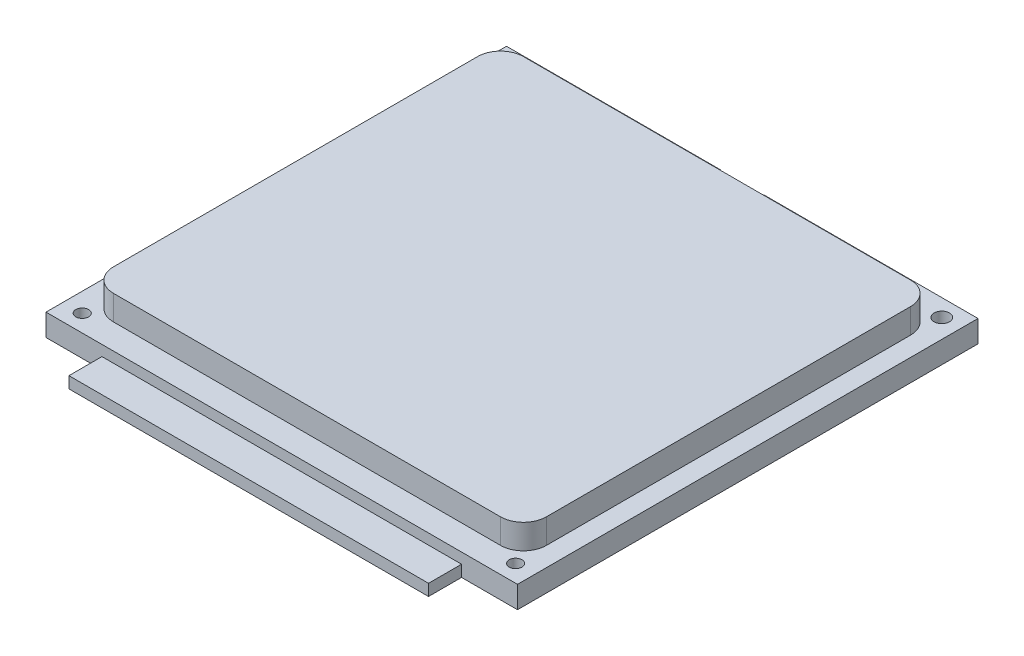
ISO-10303-21;
HEADER;
FILE_DESCRIPTION(('STEP AP214'),'2;1');
FILE_NAME('part.step','',(''),(''),'','','');
FILE_SCHEMA(('AUTOMOTIVE_DESIGN { 1 0 10303 214 1 1 1 1 }'));
ENDSEC;
DATA;
#1=APPLICATION_CONTEXT('core data for automotive mechanical design processes');
#2=APPLICATION_PROTOCOL_DEFINITION('international standard','automotive_design',2000,#1);
#3=PRODUCT_CONTEXT('',#1,'mechanical');
#4=PRODUCT('Part','Part','',(#3));
#5=PRODUCT_RELATED_PRODUCT_CATEGORY('part','',(#4));
#6=PRODUCT_DEFINITION_FORMATION('','',#4);
#7=PRODUCT_DEFINITION_CONTEXT('part definition',#1,'design');
#8=PRODUCT_DEFINITION('design','',#6,#7);
#9=PRODUCT_DEFINITION_SHAPE('','',#8);
#10=(LENGTH_UNIT() NAMED_UNIT(*) SI_UNIT(.MILLI.,.METRE.));
#11=(NAMED_UNIT(*) PLANE_ANGLE_UNIT() SI_UNIT($,.RADIAN.));
#12=(NAMED_UNIT(*) SI_UNIT($,.STERADIAN.) SOLID_ANGLE_UNIT());
#13=UNCERTAINTY_MEASURE_WITH_UNIT(LENGTH_MEASURE(1.E-05),#10,'distance_accuracy_value','');
#14=(GEOMETRIC_REPRESENTATION_CONTEXT(3) GLOBAL_UNCERTAINTY_ASSIGNED_CONTEXT((#13)) GLOBAL_UNIT_ASSIGNED_CONTEXT((#10,
#11,#12)) REPRESENTATION_CONTEXT('',''));
#15=CARTESIAN_POINT('',(0.,0.,0.));
#16=DIRECTION('',(0.,0.,1.));
#17=DIRECTION('',(1.,0.,0.));
#18=AXIS2_PLACEMENT_3D('',#15,#16,#17);
#19=CARTESIAN_POINT('',(-32.639,3.048,31.877));
#20=DIRECTION('',(0.,0.,-1.));
#21=DIRECTION('',(-1.,0.,0.));
#22=AXIS2_PLACEMENT_3D('',#19,#20,#21);
#23=PLANE('',#22);
#24=DIRECTION('',(0.,-1.,0.));
#25=VECTOR('',#24,1.);
#26=CARTESIAN_POINT('',(-24.892,1.5875,31.877));
#27=LINE('',#26,#25);
#28=CARTESIAN_POINT('',(-24.892,1.5875,31.877));
#29=VERTEX_POINT('',#28);
#30=CARTESIAN_POINT('',(-24.892,0.,31.877));
#31=VERTEX_POINT('',#30);
#32=EDGE_CURVE('E204',#29,#31,#27,.T.);
#33=ORIENTED_EDGE('',*,*,#32,.F.);
#34=DIRECTION('',(1.,0.,0.));
#35=VECTOR('',#34,1.);
#36=CARTESIAN_POINT('',(-24.892,1.5875,31.877));
#37=LINE('',#36,#35);
#38=CARTESIAN_POINT('',(24.892,1.5875,31.877));
#39=VERTEX_POINT('',#38);
#40=EDGE_CURVE('E180',#29,#39,#37,.T.);
#41=ORIENTED_EDGE('',*,*,#40,.T.);
#42=DIRECTION('',(0.,-1.,0.));
#43=VECTOR('',#42,1.);
#44=CARTESIAN_POINT('',(24.892,1.5875,31.877));
#45=LINE('',#44,#43);
#46=CARTESIAN_POINT('',(24.892,0.,31.877));
#47=VERTEX_POINT('',#46);
#48=EDGE_CURVE('E192',#39,#47,#45,.T.);
#49=ORIENTED_EDGE('',*,*,#48,.T.);
#50=DIRECTION('',(1.,0.,0.));
#51=VECTOR('',#50,1.);
#52=CARTESIAN_POINT('',(-32.639,0.,31.877));
#53=LINE('',#52,#51);
#54=CARTESIAN_POINT('',(32.639,0.,31.877));
#55=VERTEX_POINT('',#54);
#56=EDGE_CURVE('E298',#47,#55,#53,.T.);
#57=ORIENTED_EDGE('',*,*,#56,.T.);
#58=DIRECTION('',(0.,-1.,0.));
#59=VECTOR('',#58,1.);
#60=CARTESIAN_POINT('',(32.639,3.048,31.877));
#61=LINE('',#60,#59);
#62=CARTESIAN_POINT('',(32.639,3.048,31.877));
#63=VERTEX_POINT('',#62);
#64=EDGE_CURVE('E289',#63,#55,#61,.T.);
#65=ORIENTED_EDGE('',*,*,#64,.F.);
#66=DIRECTION('',(1.,0.,0.));
#67=VECTOR('',#66,1.);
#68=CARTESIAN_POINT('',(-32.639,3.048,31.877));
#69=LINE('',#68,#67);
#70=CARTESIAN_POINT('',(-32.639,3.048,31.877));
#71=VERTEX_POINT('',#70);
#72=EDGE_CURVE('E287',#71,#63,#69,.T.);
#73=ORIENTED_EDGE('',*,*,#72,.F.);
#74=DIRECTION('',(0.,-1.,0.));
#75=VECTOR('',#74,1.);
#76=CARTESIAN_POINT('',(-32.639,3.048,31.877));
#77=LINE('',#76,#75);
#78=CARTESIAN_POINT('',(-32.639,0.,31.877));
#79=VERTEX_POINT('',#78);
#80=EDGE_CURVE('E303',#71,#79,#77,.T.);
#81=ORIENTED_EDGE('',*,*,#80,.T.);
#82=EDGE_CURVE('E281',#79,#31,#53,.T.);
#83=ORIENTED_EDGE('',*,*,#82,.T.);
#84=EDGE_LOOP('',(#33,#41,#49,#57,#65,#73,#81,#83));
#85=FACE_BOUND('',#84,.T.);
#86=ADVANCED_FACE('F36',(#85),#23,.F.);
#87=CARTESIAN_POINT('',(-32.639,3.048,-31.877));
#88=DIRECTION('',(0.,0.,1.));
#89=DIRECTION('',(1.,0.,0.));
#90=AXIS2_PLACEMENT_3D('',#87,#88,#89);
#91=PLANE('',#90);
#92=DIRECTION('',(-1.,0.,0.));
#93=VECTOR('',#92,1.);
#94=CARTESIAN_POINT('',(-32.639,0.,-31.877));
#95=LINE('',#94,#93);
#96=CARTESIAN_POINT('',(32.639,0.,-31.877));
#97=VERTEX_POINT('',#96);
#98=CARTESIAN_POINT('',(2.9845,0.,-31.877));
#99=VERTEX_POINT('',#98);
#100=EDGE_CURVE('E293',#97,#99,#95,.T.);
#101=ORIENTED_EDGE('',*,*,#100,.T.);
#102=DIRECTION('',(0.,1.,0.));
#103=VECTOR('',#102,1.);
#104=CARTESIAN_POINT('',(2.9845,0.,-31.877));
#105=LINE('',#104,#103);
#106=CARTESIAN_POINT('',(2.9845,3.048,-31.877));
#107=VERTEX_POINT('',#106);
#108=EDGE_CURVE('E216',#99,#107,#105,.T.);
#109=ORIENTED_EDGE('',*,*,#108,.T.);
#110=DIRECTION('',(-1.,0.,0.));
#111=VECTOR('',#110,1.);
#112=CARTESIAN_POINT('',(-32.639,3.048,-31.877));
#113=LINE('',#112,#111);
#114=CARTESIAN_POINT('',(32.639,3.048,-31.877));
#115=VERTEX_POINT('',#114);
#116=EDGE_CURVE('E282',#115,#107,#113,.T.);
#117=ORIENTED_EDGE('',*,*,#116,.F.);
#118=DIRECTION('',(0.,-1.,0.));
#119=VECTOR('',#118,1.);
#120=CARTESIAN_POINT('',(32.639,3.048,-31.877));
#121=LINE('',#120,#119);
#122=EDGE_CURVE('E309',#115,#97,#121,.T.);
#123=ORIENTED_EDGE('',*,*,#122,.T.);
#124=EDGE_LOOP('',(#101,#109,#117,#123));
#125=FACE_BOUND('',#124,.T.);
#126=ADVANCED_FACE('F408',(#125),#91,.F.);
#127=CARTESIAN_POINT('',(32.639,3.048,-31.877));
#128=DIRECTION('',(-1.,0.,0.));
#129=DIRECTION('',(0.,0.,1.));
#130=AXIS2_PLACEMENT_3D('',#127,#128,#129);
#131=PLANE('',#130);
#132=DIRECTION('',(0.,0.,-1.));
#133=VECTOR('',#132,1.);
#134=CARTESIAN_POINT('',(32.639,0.,-31.877));
#135=LINE('',#134,#133);
#136=EDGE_CURVE('E265',#55,#97,#135,.T.);
#137=ORIENTED_EDGE('',*,*,#136,.T.);
#138=ORIENTED_EDGE('',*,*,#122,.F.);
#139=DIRECTION('',(0.,0.,-1.));
#140=VECTOR('',#139,1.);
#141=CARTESIAN_POINT('',(32.639,3.048,-31.877));
#142=LINE('',#141,#140);
#143=EDGE_CURVE('E277',#63,#115,#142,.T.);
#144=ORIENTED_EDGE('',*,*,#143,.F.);
#145=ORIENTED_EDGE('',*,*,#64,.T.);
#146=EDGE_LOOP('',(#137,#138,#144,#145));
#147=FACE_BOUND('',#146,.T.);
#148=ADVANCED_FACE('F406',(#147),#131,.F.);
#149=CARTESIAN_POINT('',(-2.9845,3.048,-31.877));
#150=VERTEX_POINT('',#149);
#151=CARTESIAN_POINT('',(-32.639,3.048,-31.877));
#152=VERTEX_POINT('',#151);
#153=EDGE_CURVE('E280',#150,#152,#113,.T.);
#154=ORIENTED_EDGE('',*,*,#153,.F.);
#155=DIRECTION('',(0.,1.,0.));
#156=VECTOR('',#155,1.);
#157=CARTESIAN_POINT('',(-2.9845,0.,-31.877));
#158=LINE('',#157,#156);
#159=CARTESIAN_POINT('',(-2.9845,0.,-31.877));
#160=VERTEX_POINT('',#159);
#161=EDGE_CURVE('E224',#160,#150,#158,.T.);
#162=ORIENTED_EDGE('',*,*,#161,.F.);
#163=CARTESIAN_POINT('',(-32.639,0.,-31.877));
#164=VERTEX_POINT('',#163);
#165=EDGE_CURVE('E292',#160,#164,#95,.T.);
#166=ORIENTED_EDGE('',*,*,#165,.T.);
#167=DIRECTION('',(0.,-1.,0.));
#168=VECTOR('',#167,1.);
#169=CARTESIAN_POINT('',(-32.639,3.048,-31.877));
#170=LINE('',#169,#168);
#171=EDGE_CURVE('E306',#152,#164,#170,.T.);
#172=ORIENTED_EDGE('',*,*,#171,.F.);
#173=EDGE_LOOP('',(#154,#162,#166,#172));
#174=FACE_BOUND('',#173,.T.);
#175=ADVANCED_FACE('F390',(#174),#91,.F.);
#176=CARTESIAN_POINT('',(-32.639,3.048,-31.877));
#177=DIRECTION('',(1.,0.,0.));
#178=DIRECTION('',(0.,0.,-1.));
#179=AXIS2_PLACEMENT_3D('',#176,#177,#178);
#180=PLANE('',#179);
#181=DIRECTION('',(0.,0.,1.));
#182=VECTOR('',#181,1.);
#183=CARTESIAN_POINT('',(-32.639,0.,-31.877));
#184=LINE('',#183,#182);
#185=EDGE_CURVE('E296',#164,#79,#184,.T.);
#186=ORIENTED_EDGE('',*,*,#185,.T.);
#187=ORIENTED_EDGE('',*,*,#80,.F.);
#188=DIRECTION('',(0.,0.,1.));
#189=VECTOR('',#188,1.);
#190=CARTESIAN_POINT('',(-32.639,3.048,-31.877));
#191=LINE('',#190,#189);
#192=EDGE_CURVE('E285',#152,#71,#191,.T.);
#193=ORIENTED_EDGE('',*,*,#192,.F.);
#194=ORIENTED_EDGE('',*,*,#171,.T.);
#195=EDGE_LOOP('',(#186,#187,#193,#194));
#196=FACE_BOUND('',#195,.T.);
#197=ADVANCED_FACE('F396',(#196),#180,.F.);
#198=CARTESIAN_POINT('',(0.,3.048,0.));
#199=DIRECTION('',(0.,1.,0.));
#200=DIRECTION('',(0.,0.,1.));
#201=AXIS2_PLACEMENT_3D('',#198,#199,#200);
#202=PLANE('',#201);
#203=DIRECTION('',(0.,0.,-1.));
#204=VECTOR('',#203,1.);
#205=CARTESIAN_POINT('',(2.9845,3.048,-28.3845));
#206=LINE('',#205,#204);
#207=CARTESIAN_POINT('',(2.9845,3.048,-28.3845));
#208=VERTEX_POINT('',#207);
#209=EDGE_CURVE('E203',#208,#107,#206,.T.);
#210=ORIENTED_EDGE('',*,*,#209,.F.);
#211=DIRECTION('',(-1.,0.,0.));
#212=VECTOR('',#211,1.);
#213=CARTESIAN_POINT('',(-29.972,3.048,-28.3845));
#214=LINE('',#213,#212);
#215=CARTESIAN_POINT('',(26.797,3.048,-28.3845));
#216=VERTEX_POINT('',#215);
#217=EDGE_CURVE('E269',#216,#208,#214,.T.);
#218=ORIENTED_EDGE('',*,*,#217,.F.);
#219=CARTESIAN_POINT('',(26.797,3.048,-25.2095));
#220=DIRECTION('',(0.,1.,0.));
#221=DIRECTION('',(0.,0.,1.));
#222=AXIS2_PLACEMENT_3D('',#219,#220,#221);
#223=CIRCLE('',#222,3.175);
#224=CARTESIAN_POINT('',(29.972,3.048,-25.2095));
#225=VERTEX_POINT('',#224);
#226=EDGE_CURVE('E343',#216,#225,#223,.F.);
#227=ORIENTED_EDGE('',*,*,#226,.T.);
#228=DIRECTION('',(0.,0.,-1.));
#229=VECTOR('',#228,1.);
#230=CARTESIAN_POINT('',(29.972,3.048,-28.3845));
#231=LINE('',#230,#229);
#232=CARTESIAN_POINT('',(29.972,3.048,25.2095));
#233=VERTEX_POINT('',#232);
#234=EDGE_CURVE('E249',#233,#225,#231,.T.);
#235=ORIENTED_EDGE('',*,*,#234,.F.);
#236=CARTESIAN_POINT('',(26.797,3.048,25.2095));
#237=DIRECTION('',(0.,1.,0.));
#238=DIRECTION('',(0.,0.,1.));
#239=AXIS2_PLACEMENT_3D('',#236,#237,#238);
#240=CIRCLE('',#239,3.175);
#241=CARTESIAN_POINT('',(26.797,3.048,28.3845));
#242=VERTEX_POINT('',#241);
#243=EDGE_CURVE('E44',#233,#242,#240,.F.);
#244=ORIENTED_EDGE('',*,*,#243,.T.);
#245=DIRECTION('',(1.,0.,0.));
#246=VECTOR('',#245,1.);
#247=CARTESIAN_POINT('',(-29.972,3.048,28.3845));
#248=LINE('',#247,#246);
#249=CARTESIAN_POINT('',(-26.797,3.048,28.3845));
#250=VERTEX_POINT('',#249);
#251=EDGE_CURVE('E256',#250,#242,#248,.T.);
#252=ORIENTED_EDGE('',*,*,#251,.F.);
#253=CARTESIAN_POINT('',(-26.797,3.048,25.2095));
#254=DIRECTION('',(0.,1.,0.));
#255=DIRECTION('',(0.,0.,1.));
#256=AXIS2_PLACEMENT_3D('',#253,#254,#255);
#257=CIRCLE('',#256,3.175);
#258=CARTESIAN_POINT('',(-29.972,3.048,25.2095));
#259=VERTEX_POINT('',#258);
#260=EDGE_CURVE('E11',#250,#259,#257,.F.);
#261=ORIENTED_EDGE('',*,*,#260,.T.);
#262=DIRECTION('',(0.,0.,1.));
#263=VECTOR('',#262,1.);
#264=CARTESIAN_POINT('',(-29.972,3.048,-28.3845));
#265=LINE('',#264,#263);
#266=CARTESIAN_POINT('',(-29.972,3.048,-25.2095));
#267=VERTEX_POINT('',#266);
#268=EDGE_CURVE('E272',#267,#259,#265,.T.);
#269=ORIENTED_EDGE('',*,*,#268,.F.);
#270=CARTESIAN_POINT('',(-26.797,3.048,-25.2095));
#271=DIRECTION('',(0.,1.,0.));
#272=DIRECTION('',(0.,0.,1.));
#273=AXIS2_PLACEMENT_3D('',#270,#271,#272);
#274=CIRCLE('',#273,3.175);
#275=CARTESIAN_POINT('',(-26.797,3.048,-28.3845));
#276=VERTEX_POINT('',#275);
#277=EDGE_CURVE('E340',#267,#276,#274,.F.);
#278=ORIENTED_EDGE('',*,*,#277,.T.);
#279=CARTESIAN_POINT('',(-2.9845,3.048,-28.3845));
#280=VERTEX_POINT('',#279);
#281=EDGE_CURVE('E268',#280,#276,#214,.T.);
#282=ORIENTED_EDGE('',*,*,#281,.F.);
#283=DIRECTION('',(0.,0.,1.));
#284=VECTOR('',#283,1.);
#285=CARTESIAN_POINT('',(-2.9845,3.048,-28.3845));
#286=LINE('',#285,#284);
#287=EDGE_CURVE('E59',#150,#280,#286,.T.);
#288=ORIENTED_EDGE('',*,*,#287,.F.);
#289=ORIENTED_EDGE('',*,*,#153,.T.);
#290=ORIENTED_EDGE('',*,*,#192,.T.);
#291=ORIENTED_EDGE('',*,*,#72,.T.);
#292=ORIENTED_EDGE('',*,*,#143,.T.);
#293=ORIENTED_EDGE('',*,*,#116,.T.);
#294=EDGE_LOOP('',(#210,#218,#227,#235,#244,#252,#261,#269,#278,#282,#288,#289,#290,#291,#292,#293));
#295=FACE_BOUND('',#294,.T.);
#296=CARTESIAN_POINT('',(-30.,3.048,29.5));
#297=DIRECTION('',(0.,1.,0.));
#298=DIRECTION('',(0.,0.,1.));
#299=AXIS2_PLACEMENT_3D('',#296,#297,#298);
#300=CIRCLE('',#299,0.889);
#301=CARTESIAN_POINT('',(-30.,3.048,30.389));
#302=VERTEX_POINT('',#301);
#303=EDGE_CURVE('E221',#302,#302,#300,.T.);
#304=ORIENTED_EDGE('',*,*,#303,.F.);
#305=EDGE_LOOP('',(#304));
#306=FACE_BOUND('',#305,.T.);
#307=CARTESIAN_POINT('',(30.,3.048,29.5));
#308=DIRECTION('',(0.,1.,0.));
#309=DIRECTION('',(0.,0.,1.));
#310=AXIS2_PLACEMENT_3D('',#307,#308,#309);
#311=CIRCLE('',#310,0.889);
#312=CARTESIAN_POINT('',(30.,3.048,30.389));
#313=VERTEX_POINT('',#312);
#314=EDGE_CURVE('E238',#313,#313,#311,.T.);
#315=ORIENTED_EDGE('',*,*,#314,.F.);
#316=EDGE_LOOP('',(#315));
#317=FACE_BOUND('',#316,.T.);
#318=CARTESIAN_POINT('',(30.,3.048,-29.5));
#319=DIRECTION('',(0.,1.,0.));
#320=DIRECTION('',(0.,0.,1.));
#321=AXIS2_PLACEMENT_3D('',#318,#319,#320);
#322=CIRCLE('',#321,1.0668);
#323=CARTESIAN_POINT('',(30.,3.048,-28.4332));
#324=VERTEX_POINT('',#323);
#325=EDGE_CURVE('E232',#324,#324,#322,.T.);
#326=ORIENTED_EDGE('',*,*,#325,.F.);
#327=EDGE_LOOP('',(#326));
#328=FACE_BOUND('',#327,.T.);
#329=CARTESIAN_POINT('',(-30.,3.048,-29.5));
#330=DIRECTION('',(0.,1.,0.));
#331=DIRECTION('',(0.,0.,1.));
#332=AXIS2_PLACEMENT_3D('',#329,#330,#331);
#333=CIRCLE('',#332,1.0668);
#334=CARTESIAN_POINT('',(-30.,3.048,-28.4332));
#335=VERTEX_POINT('',#334);
#336=EDGE_CURVE('E231',#335,#335,#333,.T.);
#337=ORIENTED_EDGE('',*,*,#336,.F.);
#338=EDGE_LOOP('',(#337));
#339=FACE_BOUND('',#338,.T.);
#340=ADVANCED_FACE('F348',(#295,#306,#317,#328,#339),#202,.T.);
#341=CARTESIAN_POINT('',(0.,0.,0.));
#342=DIRECTION('',(0.,1.,0.));
#343=DIRECTION('',(0.,0.,1.));
#344=AXIS2_PLACEMENT_3D('',#341,#342,#343);
#345=PLANE('',#344);
#346=CARTESIAN_POINT('',(-30.,0.,29.5));
#347=DIRECTION('',(0.,1.,0.));
#348=DIRECTION('',(0.,0.,1.));
#349=AXIS2_PLACEMENT_3D('',#346,#347,#348);
#350=CIRCLE('',#349,0.889);
#351=CARTESIAN_POINT('',(-30.,0.,30.389));
#352=VERTEX_POINT('',#351);
#353=EDGE_CURVE('E241',#352,#352,#350,.T.);
#354=ORIENTED_EDGE('',*,*,#353,.T.);
#355=EDGE_LOOP('',(#354));
#356=FACE_BOUND('',#355,.T.);
#357=CARTESIAN_POINT('',(30.,0.,29.5));
#358=DIRECTION('',(0.,1.,0.));
#359=DIRECTION('',(0.,0.,1.));
#360=AXIS2_PLACEMENT_3D('',#357,#358,#359);
#361=CIRCLE('',#360,0.889);
#362=CARTESIAN_POINT('',(30.,0.,30.389));
#363=VERTEX_POINT('',#362);
#364=EDGE_CURVE('E235',#363,#363,#361,.T.);
#365=ORIENTED_EDGE('',*,*,#364,.T.);
#366=EDGE_LOOP('',(#365));
#367=FACE_BOUND('',#366,.T.);
#368=CARTESIAN_POINT('',(30.,0.,-29.5));
#369=DIRECTION('',(0.,1.,0.));
#370=DIRECTION('',(0.,0.,1.));
#371=AXIS2_PLACEMENT_3D('',#368,#369,#370);
#372=CIRCLE('',#371,1.0668);
#373=CARTESIAN_POINT('',(30.,0.,-28.4332));
#374=VERTEX_POINT('',#373);
#375=EDGE_CURVE('E228',#374,#374,#372,.T.);
#376=ORIENTED_EDGE('',*,*,#375,.T.);
#377=EDGE_LOOP('',(#376));
#378=FACE_BOUND('',#377,.T.);
#379=CARTESIAN_POINT('',(-30.,0.,-29.5));
#380=DIRECTION('',(0.,1.,0.));
#381=DIRECTION('',(0.,0.,1.));
#382=AXIS2_PLACEMENT_3D('',#379,#380,#381);
#383=CIRCLE('',#382,1.0668);
#384=CARTESIAN_POINT('',(-30.,0.,-28.4332));
#385=VERTEX_POINT('',#384);
#386=EDGE_CURVE('E246',#385,#385,#383,.T.);
#387=ORIENTED_EDGE('',*,*,#386,.T.);
#388=EDGE_LOOP('',(#387));
#389=FACE_BOUND('',#388,.T.);
#390=DIRECTION('',(1.,0.,0.));
#391=VECTOR('',#390,1.);
#392=CARTESIAN_POINT('',(-2.9845,0.,-28.3845));
#393=LINE('',#392,#391);
#394=CARTESIAN_POINT('',(-2.9845,0.,-28.3845));
#395=VERTEX_POINT('',#394);
#396=CARTESIAN_POINT('',(2.9845,0.,-28.3845));
#397=VERTEX_POINT('',#396);
#398=EDGE_CURVE('E213',#395,#397,#393,.T.);
#399=ORIENTED_EDGE('',*,*,#398,.T.);
#400=DIRECTION('',(0.,0.,-1.));
#401=VECTOR('',#400,1.);
#402=CARTESIAN_POINT('',(2.9845,0.,-28.3845));
#403=LINE('',#402,#401);
#404=EDGE_CURVE('E207',#397,#99,#403,.T.);
#405=ORIENTED_EDGE('',*,*,#404,.T.);
#406=ORIENTED_EDGE('',*,*,#100,.F.);
#407=ORIENTED_EDGE('',*,*,#136,.F.);
#408=ORIENTED_EDGE('',*,*,#56,.F.);
#409=DIRECTION('',(0.,0.,1.));
#410=VECTOR('',#409,1.);
#411=CARTESIAN_POINT('',(24.892,0.,36.449));
#412=LINE('',#411,#410);
#413=CARTESIAN_POINT('',(24.892,0.,36.449));
#414=VERTEX_POINT('',#413);
#415=EDGE_CURVE('E51',#47,#414,#412,.T.);
#416=ORIENTED_EDGE('',*,*,#415,.T.);
#417=DIRECTION('',(-1.,0.,0.));
#418=VECTOR('',#417,1.);
#419=CARTESIAN_POINT('',(-24.892,0.,36.449));
#420=LINE('',#419,#418);
#421=CARTESIAN_POINT('',(-24.892,0.,36.449));
#422=VERTEX_POINT('',#421);
#423=EDGE_CURVE('E177',#414,#422,#420,.T.);
#424=ORIENTED_EDGE('',*,*,#423,.T.);
#425=DIRECTION('',(0.,0.,-1.));
#426=VECTOR('',#425,1.);
#427=CARTESIAN_POINT('',(-24.892,0.,36.449));
#428=LINE('',#427,#426);
#429=EDGE_CURVE('E193',#422,#31,#428,.T.);
#430=ORIENTED_EDGE('',*,*,#429,.T.);
#431=ORIENTED_EDGE('',*,*,#82,.F.);
#432=ORIENTED_EDGE('',*,*,#185,.F.);
#433=ORIENTED_EDGE('',*,*,#165,.F.);
#434=DIRECTION('',(0.,0.,1.));
#435=VECTOR('',#434,1.);
#436=CARTESIAN_POINT('',(-2.9845,0.,-28.3845));
#437=LINE('',#436,#435);
#438=EDGE_CURVE('E210',#160,#395,#437,.T.);
#439=ORIENTED_EDGE('',*,*,#438,.T.);
#440=EDGE_LOOP('',(#399,#405,#406,#407,#408,#416,#424,#430,#431,#432,#433,#439));
#441=FACE_BOUND('',#440,.T.);
#442=ADVANCED_FACE('F414',(#356,#367,#378,#389,#441),#345,.F.);
#443=CARTESIAN_POINT('',(29.972,6.477,-28.3845));
#444=DIRECTION('',(-1.,0.,0.));
#445=DIRECTION('',(0.,0.,1.));
#446=AXIS2_PLACEMENT_3D('',#443,#444,#445);
#447=PLANE('',#446);
#448=ORIENTED_EDGE('',*,*,#234,.T.);
#449=DIRECTION('',(0.,-1.,0.));
#450=VECTOR('',#449,1.);
#451=CARTESIAN_POINT('',(29.972,6.477,-25.2095));
#452=LINE('',#451,#450);
#453=CARTESIAN_POINT('',(29.972,6.477,-25.2095));
#454=VERTEX_POINT('',#453);
#455=EDGE_CURVE('E333',#225,#454,#452,.F.);
#456=ORIENTED_EDGE('',*,*,#455,.T.);
#457=DIRECTION('',(0.,0.,-1.));
#458=VECTOR('',#457,1.);
#459=CARTESIAN_POINT('',(29.972,6.477,-28.3845));
#460=LINE('',#459,#458);
#461=CARTESIAN_POINT('',(29.972,6.477,25.2095));
#462=VERTEX_POINT('',#461);
#463=EDGE_CURVE('E252',#462,#454,#460,.T.);
#464=ORIENTED_EDGE('',*,*,#463,.F.);
#465=DIRECTION('',(0.,-1.,0.));
#466=VECTOR('',#465,1.);
#467=CARTESIAN_POINT('',(29.972,6.477,25.2095));
#468=LINE('',#467,#466);
#469=EDGE_CURVE('E330',#462,#233,#468,.T.);
#470=ORIENTED_EDGE('',*,*,#469,.T.);
#471=EDGE_LOOP('',(#448,#456,#464,#470));
#472=FACE_BOUND('',#471,.T.);
#473=ADVANCED_FACE('F364',(#472),#447,.F.);
#474=CARTESIAN_POINT('',(-29.972,6.477,-28.3845));
#475=DIRECTION('',(0.,0.,1.));
#476=DIRECTION('',(1.,0.,0.));
#477=AXIS2_PLACEMENT_3D('',#474,#475,#476);
#478=PLANE('',#477);
#479=ORIENTED_EDGE('',*,*,#217,.T.);
#480=DIRECTION('',(0.,1.,0.));
#481=VECTOR('',#480,1.);
#482=CARTESIAN_POINT('',(2.9845,0.,-28.3845));
#483=LINE('',#482,#481);
#484=EDGE_CURVE('E219',#397,#208,#483,.T.);
#485=ORIENTED_EDGE('',*,*,#484,.F.);
#486=ORIENTED_EDGE('',*,*,#398,.F.);
#487=DIRECTION('',(0.,1.,0.));
#488=VECTOR('',#487,1.);
#489=CARTESIAN_POINT('',(-2.9845,0.,-28.3845));
#490=LINE('',#489,#488);
#491=EDGE_CURVE('E222',#395,#280,#490,.T.);
#492=ORIENTED_EDGE('',*,*,#491,.T.);
#493=ORIENTED_EDGE('',*,*,#281,.T.);
#494=DIRECTION('',(0.,-1.,0.));
#495=VECTOR('',#494,1.);
#496=CARTESIAN_POINT('',(-26.797,6.477,-28.3845));
#497=LINE('',#496,#495);
#498=CARTESIAN_POINT('',(-26.797,6.477,-28.3845));
#499=VERTEX_POINT('',#498);
#500=EDGE_CURVE('E320',#276,#499,#497,.F.);
#501=ORIENTED_EDGE('',*,*,#500,.T.);
#502=DIRECTION('',(-1.,0.,0.));
#503=VECTOR('',#502,1.);
#504=CARTESIAN_POINT('',(-29.972,6.477,-28.3845));
#505=LINE('',#504,#503);
#506=CARTESIAN_POINT('',(26.797,6.477,-28.3845));
#507=VERTEX_POINT('',#506);
#508=EDGE_CURVE('E255',#507,#499,#505,.T.);
#509=ORIENTED_EDGE('',*,*,#508,.F.);
#510=DIRECTION('',(0.,-1.,0.));
#511=VECTOR('',#510,1.);
#512=CARTESIAN_POINT('',(26.797,6.477,-28.3845));
#513=LINE('',#512,#511);
#514=EDGE_CURVE('E317',#507,#216,#513,.T.);
#515=ORIENTED_EDGE('',*,*,#514,.T.);
#516=EDGE_LOOP('',(#479,#485,#486,#492,#493,#501,#509,#515));
#517=FACE_BOUND('',#516,.T.);
#518=ADVANCED_FACE('F372',(#517),#478,.F.);
#519=CARTESIAN_POINT('',(-29.972,6.477,-28.3845));
#520=DIRECTION('',(1.,0.,0.));
#521=DIRECTION('',(0.,0.,-1.));
#522=AXIS2_PLACEMENT_3D('',#519,#520,#521);
#523=PLANE('',#522);
#524=DIRECTION('',(0.,0.,1.));
#525=VECTOR('',#524,1.);
#526=CARTESIAN_POINT('',(-29.972,6.477,-28.3845));
#527=LINE('',#526,#525);
#528=CARTESIAN_POINT('',(-29.972,6.477,-25.2095));
#529=VERTEX_POINT('',#528);
#530=CARTESIAN_POINT('',(-29.972,6.477,25.2095));
#531=VERTEX_POINT('',#530);
#532=EDGE_CURVE('E259',#529,#531,#527,.T.);
#533=ORIENTED_EDGE('',*,*,#532,.F.);
#534=DIRECTION('',(0.,-1.,0.));
#535=VECTOR('',#534,1.);
#536=CARTESIAN_POINT('',(-29.972,6.477,-25.2095));
#537=LINE('',#536,#535);
#538=EDGE_CURVE('E314',#529,#267,#537,.T.);
#539=ORIENTED_EDGE('',*,*,#538,.T.);
#540=ORIENTED_EDGE('',*,*,#268,.T.);
#541=DIRECTION('',(0.,-1.,0.));
#542=VECTOR('',#541,1.);
#543=CARTESIAN_POINT('',(-29.972,6.477,25.2095));
#544=LINE('',#543,#542);
#545=EDGE_CURVE('E312',#259,#531,#544,.F.);
#546=ORIENTED_EDGE('',*,*,#545,.T.);
#547=EDGE_LOOP('',(#533,#539,#540,#546));
#548=FACE_BOUND('',#547,.T.);
#549=ADVANCED_FACE('F382',(#548),#523,.F.);
#550=CARTESIAN_POINT('',(-29.972,6.477,28.3845));
#551=DIRECTION('',(0.,0.,-1.));
#552=DIRECTION('',(-1.,0.,0.));
#553=AXIS2_PLACEMENT_3D('',#550,#551,#552);
#554=PLANE('',#553);
#555=ORIENTED_EDGE('',*,*,#251,.T.);
#556=DIRECTION('',(0.,-1.,0.));
#557=VECTOR('',#556,1.);
#558=CARTESIAN_POINT('',(26.797,6.477,28.3845));
#559=LINE('',#558,#557);
#560=CARTESIAN_POINT('',(26.797,6.477,28.3845));
#561=VERTEX_POINT('',#560);
#562=EDGE_CURVE('E338',#242,#561,#559,.F.);
#563=ORIENTED_EDGE('',*,*,#562,.T.);
#564=DIRECTION('',(1.,0.,0.));
#565=VECTOR('',#564,1.);
#566=CARTESIAN_POINT('',(-29.972,6.477,28.3845));
#567=LINE('',#566,#565);
#568=CARTESIAN_POINT('',(-26.797,6.477,28.3845));
#569=VERTEX_POINT('',#568);
#570=EDGE_CURVE('E262',#569,#561,#567,.T.);
#571=ORIENTED_EDGE('',*,*,#570,.F.);
#572=DIRECTION('',(0.,-1.,0.));
#573=VECTOR('',#572,1.);
#574=CARTESIAN_POINT('',(-26.797,6.477,28.3845));
#575=LINE('',#574,#573);
#576=EDGE_CURVE('E335',#569,#250,#575,.T.);
#577=ORIENTED_EDGE('',*,*,#576,.T.);
#578=EDGE_LOOP('',(#555,#563,#571,#577));
#579=FACE_BOUND('',#578,.T.);
#580=ADVANCED_FACE('F354',(#579),#554,.F.);
#581=CARTESIAN_POINT('',(0.,6.477,0.));
#582=DIRECTION('',(0.,1.,0.));
#583=DIRECTION('',(0.,0.,1.));
#584=AXIS2_PLACEMENT_3D('',#581,#582,#583);
#585=PLANE('',#584);
#586=ORIENTED_EDGE('',*,*,#508,.T.);
#587=CARTESIAN_POINT('',(-26.797,6.477,-25.2095));
#588=DIRECTION('',(0.,1.,0.));
#589=DIRECTION('',(0.,0.,1.));
#590=AXIS2_PLACEMENT_3D('',#587,#588,#589);
#591=CIRCLE('',#590,3.175);
#592=EDGE_CURVE('E328',#499,#529,#591,.T.);
#593=ORIENTED_EDGE('',*,*,#592,.T.);
#594=ORIENTED_EDGE('',*,*,#532,.T.);
#595=CARTESIAN_POINT('',(-26.797,6.477,25.2095));
#596=DIRECTION('',(0.,1.,0.));
#597=DIRECTION('',(0.,0.,1.));
#598=AXIS2_PLACEMENT_3D('',#595,#596,#597);
#599=CIRCLE('',#598,3.175);
#600=EDGE_CURVE('E322',#531,#569,#599,.T.);
#601=ORIENTED_EDGE('',*,*,#600,.T.);
#602=ORIENTED_EDGE('',*,*,#570,.T.);
#603=CARTESIAN_POINT('',(26.797,6.477,25.2095));
#604=DIRECTION('',(0.,1.,0.));
#605=DIRECTION('',(0.,0.,1.));
#606=AXIS2_PLACEMENT_3D('',#603,#604,#605);
#607=CIRCLE('',#606,3.175);
#608=EDGE_CURVE('E324',#561,#462,#607,.T.);
#609=ORIENTED_EDGE('',*,*,#608,.T.);
#610=ORIENTED_EDGE('',*,*,#463,.T.);
#611=CARTESIAN_POINT('',(26.797,6.477,-25.2095));
#612=DIRECTION('',(0.,1.,0.));
#613=DIRECTION('',(0.,0.,1.));
#614=AXIS2_PLACEMENT_3D('',#611,#612,#613);
#615=CIRCLE('',#614,3.175);
#616=EDGE_CURVE('E326',#454,#507,#615,.T.);
#617=ORIENTED_EDGE('',*,*,#616,.T.);
#618=EDGE_LOOP('',(#586,#593,#594,#601,#602,#609,#610,#617));
#619=FACE_BOUND('',#618,.T.);
#620=ADVANCED_FACE('F361',(#619),#585,.T.);
#621=CARTESIAN_POINT('',(-30.,0.,-29.5));
#622=DIRECTION('',(0.,1.,0.));
#623=DIRECTION('',(0.,0.,1.));
#624=AXIS2_PLACEMENT_3D('',#621,#622,#623);
#625=CYLINDRICAL_SURFACE('',#624,1.0668);
#626=CARTESIAN_POINT('',(-30.,0.,-28.4332));
#627=CARTESIAN_POINT('',(-30.,0.03175,-28.4332));
#628=CARTESIAN_POINT('',(-30.,0.0635,-28.4332));
#629=CARTESIAN_POINT('',(-30.,0.127,-28.4332));
#630=CARTESIAN_POINT('',(-30.,0.15875,-28.4332));
#631=CARTESIAN_POINT('',(-30.,0.22225,-28.4332));
#632=CARTESIAN_POINT('',(-30.,0.254,-28.4332));
#633=CARTESIAN_POINT('',(-30.,0.3175,-28.4332));
#634=CARTESIAN_POINT('',(-30.,0.34925,-28.4332));
#635=CARTESIAN_POINT('',(-30.,0.41275,-28.4332));
#636=CARTESIAN_POINT('',(-30.,0.4445,-28.4332));
#637=CARTESIAN_POINT('',(-30.,0.508,-28.4332));
#638=CARTESIAN_POINT('',(-30.,0.53975,-28.4332));
#639=CARTESIAN_POINT('',(-30.,0.60325,-28.4332));
#640=CARTESIAN_POINT('',(-30.,0.635,-28.4332));
#641=CARTESIAN_POINT('',(-30.,0.6985,-28.4332));
#642=CARTESIAN_POINT('',(-30.,0.73025,-28.4332));
#643=CARTESIAN_POINT('',(-30.,0.79375,-28.4332));
#644=CARTESIAN_POINT('',(-30.,0.8255,-28.4332));
#645=CARTESIAN_POINT('',(-30.,0.889,-28.4332));
#646=CARTESIAN_POINT('',(-30.,0.92075,-28.4332));
#647=CARTESIAN_POINT('',(-30.,0.98425,-28.4332));
#648=CARTESIAN_POINT('',(-30.,1.016,-28.4332));
#649=CARTESIAN_POINT('',(-30.,1.0795,-28.4332));
#650=CARTESIAN_POINT('',(-30.,1.11125,-28.4332));
#651=CARTESIAN_POINT('',(-30.,1.17475,-28.4332));
#652=CARTESIAN_POINT('',(-30.,1.2065,-28.4332));
#653=CARTESIAN_POINT('',(-30.,1.27,-28.4332));
#654=CARTESIAN_POINT('',(-30.,1.30175,-28.4332));
#655=CARTESIAN_POINT('',(-30.,1.36525,-28.4332));
#656=CARTESIAN_POINT('',(-30.,1.397,-28.4332));
#657=CARTESIAN_POINT('',(-30.,1.4605,-28.4332));
#658=CARTESIAN_POINT('',(-30.,1.49225,-28.4332));
#659=CARTESIAN_POINT('',(-30.,1.55575,-28.4332));
#660=CARTESIAN_POINT('',(-30.,1.5875,-28.4332));
#661=CARTESIAN_POINT('',(-30.,1.651,-28.4332));
#662=CARTESIAN_POINT('',(-30.,1.68275,-28.4332));
#663=CARTESIAN_POINT('',(-30.,1.74625,-28.4332));
#664=CARTESIAN_POINT('',(-30.,1.778,-28.4332));
#665=CARTESIAN_POINT('',(-30.,1.8415,-28.4332));
#666=CARTESIAN_POINT('',(-30.,1.87325,-28.4332));
#667=CARTESIAN_POINT('',(-30.,1.93675,-28.4332));
#668=CARTESIAN_POINT('',(-30.,1.9685,-28.4332));
#669=CARTESIAN_POINT('',(-30.,2.032,-28.4332));
#670=CARTESIAN_POINT('',(-30.,2.06375,-28.4332));
#671=CARTESIAN_POINT('',(-30.,2.12725,-28.4332));
#672=CARTESIAN_POINT('',(-30.,2.159,-28.4332));
#673=CARTESIAN_POINT('',(-30.,2.2225,-28.4332));
#674=CARTESIAN_POINT('',(-30.,2.25425,-28.4332));
#675=CARTESIAN_POINT('',(-30.,2.31775,-28.4332));
#676=CARTESIAN_POINT('',(-30.,2.3495,-28.4332));
#677=CARTESIAN_POINT('',(-30.,2.413,-28.4332));
#678=CARTESIAN_POINT('',(-30.,2.44475,-28.4332));
#679=CARTESIAN_POINT('',(-30.,2.50825,-28.4332));
#680=CARTESIAN_POINT('',(-30.,2.54,-28.4332));
#681=CARTESIAN_POINT('',(-30.,2.6035,-28.4332));
#682=CARTESIAN_POINT('',(-30.,2.63525,-28.4332));
#683=CARTESIAN_POINT('',(-30.,2.69875,-28.4332));
#684=CARTESIAN_POINT('',(-30.,2.7305,-28.4332));
#685=CARTESIAN_POINT('',(-30.,2.794,-28.4332));
#686=CARTESIAN_POINT('',(-30.,2.82575,-28.4332));
#687=CARTESIAN_POINT('',(-30.,2.88925,-28.4332));
#688=CARTESIAN_POINT('',(-30.,2.921,-28.4332));
#689=CARTESIAN_POINT('',(-30.,2.9845,-28.4332));
#690=CARTESIAN_POINT('',(-30.,3.01625,-28.4332));
#691=CARTESIAN_POINT('',(-30.,3.048,-28.4332));
#692=B_SPLINE_CURVE_WITH_KNOTS('',3,(#626,#627,#628,#629,#630,#631,#632,#633,#634,#635,#636,
#637,#638,#639,#640,#641,#642,#643,#644,#645,#646,#647,#648,#649,#650,#651,#652,#653,#654,#655,
#656,#657,#658,#659,#660,#661,#662,#663,#664,#665,#666,#667,#668,#669,#670,#671,#672,#673,#674,
#675,#676,#677,#678,#679,#680,#681,#682,#683,#684,#685,#686,#687,#688,#689,#690,#691),
.UNSPECIFIED.,.F.,.F.,(4,2,2,2,2,2,2,2,2,2,2,2,2,2,2,2,2,2,2,2,2,2,2,2,2,2,2,2,2,2,2,2,4),(0.,
0.09525,0.1905,0.28575,0.381,0.47625,0.5715,0.66675,0.762,0.85725,0.9525,1.04775,1.143,1.23825,
1.3335,1.42875,1.524,1.61925,1.7145,1.80975,1.905,2.00025,2.0955,2.19075,2.286,2.38125,2.4765,
2.57175,2.667,2.76225,2.8575,2.95275,3.048),.UNSPECIFIED.);
#693=EDGE_CURVE('BSEAM540',#385,#335,#692,.T.);
#694=ORIENTED_EDGE('',*,*,#386,.F.);
#695=ORIENTED_EDGE('',*,*,#336,.T.);
#696=ORIENTED_EDGE('',*,*,#693,.T.);
#697=ORIENTED_EDGE('',*,*,#693,.F.);
#698=EDGE_LOOP('',(#694,#696,#695,#697));
#699=FACE_BOUND('',#698,.T.);
#700=ADVANCED_FACE('F540',(#699),#625,.F.);
#701=CARTESIAN_POINT('',(30.,0.,-29.5));
#702=DIRECTION('',(0.,1.,0.));
#703=DIRECTION('',(0.,0.,1.));
#704=AXIS2_PLACEMENT_3D('',#701,#702,#703);
#705=CYLINDRICAL_SURFACE('',#704,1.0668);
#706=CARTESIAN_POINT('',(30.,0.,-28.4332));
#707=CARTESIAN_POINT('',(30.,0.03175,-28.4332));
#708=CARTESIAN_POINT('',(30.,0.0635,-28.4332));
#709=CARTESIAN_POINT('',(30.,0.127,-28.4332));
#710=CARTESIAN_POINT('',(30.,0.15875,-28.4332));
#711=CARTESIAN_POINT('',(30.,0.22225,-28.4332));
#712=CARTESIAN_POINT('',(30.,0.254,-28.4332));
#713=CARTESIAN_POINT('',(30.,0.3175,-28.4332));
#714=CARTESIAN_POINT('',(30.,0.34925,-28.4332));
#715=CARTESIAN_POINT('',(30.,0.41275,-28.4332));
#716=CARTESIAN_POINT('',(30.,0.4445,-28.4332));
#717=CARTESIAN_POINT('',(30.,0.508,-28.4332));
#718=CARTESIAN_POINT('',(30.,0.53975,-28.4332));
#719=CARTESIAN_POINT('',(30.,0.60325,-28.4332));
#720=CARTESIAN_POINT('',(30.,0.635,-28.4332));
#721=CARTESIAN_POINT('',(30.,0.6985,-28.4332));
#722=CARTESIAN_POINT('',(30.,0.73025,-28.4332));
#723=CARTESIAN_POINT('',(30.,0.79375,-28.4332));
#724=CARTESIAN_POINT('',(30.,0.8255,-28.4332));
#725=CARTESIAN_POINT('',(30.,0.889,-28.4332));
#726=CARTESIAN_POINT('',(30.,0.92075,-28.4332));
#727=CARTESIAN_POINT('',(30.,0.98425,-28.4332));
#728=CARTESIAN_POINT('',(30.,1.016,-28.4332));
#729=CARTESIAN_POINT('',(30.,1.0795,-28.4332));
#730=CARTESIAN_POINT('',(30.,1.11125,-28.4332));
#731=CARTESIAN_POINT('',(30.,1.17475,-28.4332));
#732=CARTESIAN_POINT('',(30.,1.2065,-28.4332));
#733=CARTESIAN_POINT('',(30.,1.27,-28.4332));
#734=CARTESIAN_POINT('',(30.,1.30175,-28.4332));
#735=CARTESIAN_POINT('',(30.,1.36525,-28.4332));
#736=CARTESIAN_POINT('',(30.,1.397,-28.4332));
#737=CARTESIAN_POINT('',(30.,1.4605,-28.4332));
#738=CARTESIAN_POINT('',(30.,1.49225,-28.4332));
#739=CARTESIAN_POINT('',(30.,1.55575,-28.4332));
#740=CARTESIAN_POINT('',(30.,1.5875,-28.4332));
#741=CARTESIAN_POINT('',(30.,1.651,-28.4332));
#742=CARTESIAN_POINT('',(30.,1.68275,-28.4332));
#743=CARTESIAN_POINT('',(30.,1.74625,-28.4332));
#744=CARTESIAN_POINT('',(30.,1.778,-28.4332));
#745=CARTESIAN_POINT('',(30.,1.8415,-28.4332));
#746=CARTESIAN_POINT('',(30.,1.87325,-28.4332));
#747=CARTESIAN_POINT('',(30.,1.93675,-28.4332));
#748=CARTESIAN_POINT('',(30.,1.9685,-28.4332));
#749=CARTESIAN_POINT('',(30.,2.032,-28.4332));
#750=CARTESIAN_POINT('',(30.,2.06375,-28.4332));
#751=CARTESIAN_POINT('',(30.,2.12725,-28.4332));
#752=CARTESIAN_POINT('',(30.,2.159,-28.4332));
#753=CARTESIAN_POINT('',(30.,2.2225,-28.4332));
#754=CARTESIAN_POINT('',(30.,2.25425,-28.4332));
#755=CARTESIAN_POINT('',(30.,2.31775,-28.4332));
#756=CARTESIAN_POINT('',(30.,2.3495,-28.4332));
#757=CARTESIAN_POINT('',(30.,2.413,-28.4332));
#758=CARTESIAN_POINT('',(30.,2.44475,-28.4332));
#759=CARTESIAN_POINT('',(30.,2.50825,-28.4332));
#760=CARTESIAN_POINT('',(30.,2.54,-28.4332));
#761=CARTESIAN_POINT('',(30.,2.6035,-28.4332));
#762=CARTESIAN_POINT('',(30.,2.63525,-28.4332));
#763=CARTESIAN_POINT('',(30.,2.69875,-28.4332));
#764=CARTESIAN_POINT('',(30.,2.7305,-28.4332));
#765=CARTESIAN_POINT('',(30.,2.794,-28.4332));
#766=CARTESIAN_POINT('',(30.,2.82575,-28.4332));
#767=CARTESIAN_POINT('',(30.,2.88925,-28.4332));
#768=CARTESIAN_POINT('',(30.,2.921,-28.4332));
#769=CARTESIAN_POINT('',(30.,2.9845,-28.4332));
#770=CARTESIAN_POINT('',(30.,3.01625,-28.4332));
#771=CARTESIAN_POINT('',(30.,3.048,-28.4332));
#772=B_SPLINE_CURVE_WITH_KNOTS('',3,(#706,#707,#708,#709,#710,#711,#712,#713,#714,#715,#716,
#717,#718,#719,#720,#721,#722,#723,#724,#725,#726,#727,#728,#729,#730,#731,#732,#733,#734,#735,
#736,#737,#738,#739,#740,#741,#742,#743,#744,#745,#746,#747,#748,#749,#750,#751,#752,#753,#754,
#755,#756,#757,#758,#759,#760,#761,#762,#763,#764,#765,#766,#767,#768,#769,#770,#771),
.UNSPECIFIED.,.F.,.F.,(4,2,2,2,2,2,2,2,2,2,2,2,2,2,2,2,2,2,2,2,2,2,2,2,2,2,2,2,2,2,2,2,4),(0.,
0.09525,0.1905,0.28575,0.381,0.47625,0.5715,0.66675,0.762,0.85725,0.9525,1.04775,1.143,1.23825,
1.3335,1.42875,1.524,1.61925,1.7145,1.80975,1.905,2.00025,2.0955,2.19075,2.286,2.38125,2.4765,
2.57175,2.667,2.76225,2.8575,2.95275,3.048),.UNSPECIFIED.);
#773=EDGE_CURVE('BSEAM548',#374,#324,#772,.T.);
#774=ORIENTED_EDGE('',*,*,#375,.F.);
#775=ORIENTED_EDGE('',*,*,#325,.T.);
#776=ORIENTED_EDGE('',*,*,#773,.T.);
#777=ORIENTED_EDGE('',*,*,#773,.F.);
#778=EDGE_LOOP('',(#774,#776,#775,#777));
#779=FACE_BOUND('',#778,.T.);
#780=ADVANCED_FACE('F548',(#779),#705,.F.);
#781=CARTESIAN_POINT('',(30.,0.,29.5));
#782=DIRECTION('',(0.,1.,0.));
#783=DIRECTION('',(0.,0.,1.));
#784=AXIS2_PLACEMENT_3D('',#781,#782,#783);
#785=CYLINDRICAL_SURFACE('',#784,0.889);
#786=CARTESIAN_POINT('',(30.,0.,30.389));
#787=CARTESIAN_POINT('',(30.,0.03175,30.389));
#788=CARTESIAN_POINT('',(30.,0.0635,30.389));
#789=CARTESIAN_POINT('',(30.,0.127,30.389));
#790=CARTESIAN_POINT('',(30.,0.15875,30.389));
#791=CARTESIAN_POINT('',(30.,0.22225,30.389));
#792=CARTESIAN_POINT('',(30.,0.254,30.389));
#793=CARTESIAN_POINT('',(30.,0.3175,30.389));
#794=CARTESIAN_POINT('',(30.,0.34925,30.389));
#795=CARTESIAN_POINT('',(30.,0.41275,30.389));
#796=CARTESIAN_POINT('',(30.,0.4445,30.389));
#797=CARTESIAN_POINT('',(30.,0.508,30.389));
#798=CARTESIAN_POINT('',(30.,0.53975,30.389));
#799=CARTESIAN_POINT('',(30.,0.60325,30.389));
#800=CARTESIAN_POINT('',(30.,0.635,30.389));
#801=CARTESIAN_POINT('',(30.,0.6985,30.389));
#802=CARTESIAN_POINT('',(30.,0.73025,30.389));
#803=CARTESIAN_POINT('',(30.,0.79375,30.389));
#804=CARTESIAN_POINT('',(30.,0.8255,30.389));
#805=CARTESIAN_POINT('',(30.,0.889,30.389));
#806=CARTESIAN_POINT('',(30.,0.92075,30.389));
#807=CARTESIAN_POINT('',(30.,0.98425,30.389));
#808=CARTESIAN_POINT('',(30.,1.016,30.389));
#809=CARTESIAN_POINT('',(30.,1.0795,30.389));
#810=CARTESIAN_POINT('',(30.,1.11125,30.389));
#811=CARTESIAN_POINT('',(30.,1.17475,30.389));
#812=CARTESIAN_POINT('',(30.,1.2065,30.389));
#813=CARTESIAN_POINT('',(30.,1.27,30.389));
#814=CARTESIAN_POINT('',(30.,1.30175,30.389));
#815=CARTESIAN_POINT('',(30.,1.36525,30.389));
#816=CARTESIAN_POINT('',(30.,1.397,30.389));
#817=CARTESIAN_POINT('',(30.,1.4605,30.389));
#818=CARTESIAN_POINT('',(30.,1.49225,30.389));
#819=CARTESIAN_POINT('',(30.,1.55575,30.389));
#820=CARTESIAN_POINT('',(30.,1.5875,30.389));
#821=CARTESIAN_POINT('',(30.,1.651,30.389));
#822=CARTESIAN_POINT('',(30.,1.68275,30.389));
#823=CARTESIAN_POINT('',(30.,1.74625,30.389));
#824=CARTESIAN_POINT('',(30.,1.778,30.389));
#825=CARTESIAN_POINT('',(30.,1.8415,30.389));
#826=CARTESIAN_POINT('',(30.,1.87325,30.389));
#827=CARTESIAN_POINT('',(30.,1.93675,30.389));
#828=CARTESIAN_POINT('',(30.,1.9685,30.389));
#829=CARTESIAN_POINT('',(30.,2.032,30.389));
#830=CARTESIAN_POINT('',(30.,2.06375,30.389));
#831=CARTESIAN_POINT('',(30.,2.12725,30.389));
#832=CARTESIAN_POINT('',(30.,2.159,30.389));
#833=CARTESIAN_POINT('',(30.,2.2225,30.389));
#834=CARTESIAN_POINT('',(30.,2.25425,30.389));
#835=CARTESIAN_POINT('',(30.,2.31775,30.389));
#836=CARTESIAN_POINT('',(30.,2.3495,30.389));
#837=CARTESIAN_POINT('',(30.,2.413,30.389));
#838=CARTESIAN_POINT('',(30.,2.44475,30.389));
#839=CARTESIAN_POINT('',(30.,2.50825,30.389));
#840=CARTESIAN_POINT('',(30.,2.54,30.389));
#841=CARTESIAN_POINT('',(30.,2.6035,30.389));
#842=CARTESIAN_POINT('',(30.,2.63525,30.389));
#843=CARTESIAN_POINT('',(30.,2.69875,30.389));
#844=CARTESIAN_POINT('',(30.,2.7305,30.389));
#845=CARTESIAN_POINT('',(30.,2.794,30.389));
#846=CARTESIAN_POINT('',(30.,2.82575,30.389));
#847=CARTESIAN_POINT('',(30.,2.88925,30.389));
#848=CARTESIAN_POINT('',(30.,2.921,30.389));
#849=CARTESIAN_POINT('',(30.,2.9845,30.389));
#850=CARTESIAN_POINT('',(30.,3.01625,30.389));
#851=CARTESIAN_POINT('',(30.,3.048,30.389));
#852=B_SPLINE_CURVE_WITH_KNOTS('',3,(#786,#787,#788,#789,#790,#791,#792,#793,#794,#795,#796,
#797,#798,#799,#800,#801,#802,#803,#804,#805,#806,#807,#808,#809,#810,#811,#812,#813,#814,#815,
#816,#817,#818,#819,#820,#821,#822,#823,#824,#825,#826,#827,#828,#829,#830,#831,#832,#833,#834,
#835,#836,#837,#838,#839,#840,#841,#842,#843,#844,#845,#846,#847,#848,#849,#850,#851),
.UNSPECIFIED.,.F.,.F.,(4,2,2,2,2,2,2,2,2,2,2,2,2,2,2,2,2,2,2,2,2,2,2,2,2,2,2,2,2,2,2,2,4),(0.,
0.09525,0.1905,0.28575,0.381,0.47625,0.5715,0.66675,0.762,0.85725,0.9525,1.04775,1.143,1.23825,
1.3335,1.42875,1.524,1.61925,1.7145,1.80975,1.905,2.00025,2.0955,2.19075,2.286,2.38125,2.4765,
2.57175,2.667,2.76225,2.8575,2.95275,3.048),.UNSPECIFIED.);
#853=EDGE_CURVE('BSEAM557',#363,#313,#852,.T.);
#854=ORIENTED_EDGE('',*,*,#364,.F.);
#855=ORIENTED_EDGE('',*,*,#314,.T.);
#856=ORIENTED_EDGE('',*,*,#853,.T.);
#857=ORIENTED_EDGE('',*,*,#853,.F.);
#858=EDGE_LOOP('',(#854,#856,#855,#857));
#859=FACE_BOUND('',#858,.T.);
#860=ADVANCED_FACE('F557',(#859),#785,.F.);
#861=CARTESIAN_POINT('',(-30.,0.,29.5));
#862=DIRECTION('',(0.,1.,0.));
#863=DIRECTION('',(0.,0.,1.));
#864=AXIS2_PLACEMENT_3D('',#861,#862,#863);
#865=CYLINDRICAL_SURFACE('',#864,0.889);
#866=CARTESIAN_POINT('',(-30.,0.,30.389));
#867=CARTESIAN_POINT('',(-30.,0.03175,30.389));
#868=CARTESIAN_POINT('',(-30.,0.0635,30.389));
#869=CARTESIAN_POINT('',(-30.,0.127,30.389));
#870=CARTESIAN_POINT('',(-30.,0.15875,30.389));
#871=CARTESIAN_POINT('',(-30.,0.22225,30.389));
#872=CARTESIAN_POINT('',(-30.,0.254,30.389));
#873=CARTESIAN_POINT('',(-30.,0.3175,30.389));
#874=CARTESIAN_POINT('',(-30.,0.34925,30.389));
#875=CARTESIAN_POINT('',(-30.,0.41275,30.389));
#876=CARTESIAN_POINT('',(-30.,0.4445,30.389));
#877=CARTESIAN_POINT('',(-30.,0.508,30.389));
#878=CARTESIAN_POINT('',(-30.,0.53975,30.389));
#879=CARTESIAN_POINT('',(-30.,0.60325,30.389));
#880=CARTESIAN_POINT('',(-30.,0.635,30.389));
#881=CARTESIAN_POINT('',(-30.,0.6985,30.389));
#882=CARTESIAN_POINT('',(-30.,0.73025,30.389));
#883=CARTESIAN_POINT('',(-30.,0.79375,30.389));
#884=CARTESIAN_POINT('',(-30.,0.8255,30.389));
#885=CARTESIAN_POINT('',(-30.,0.889,30.389));
#886=CARTESIAN_POINT('',(-30.,0.92075,30.389));
#887=CARTESIAN_POINT('',(-30.,0.98425,30.389));
#888=CARTESIAN_POINT('',(-30.,1.016,30.389));
#889=CARTESIAN_POINT('',(-30.,1.0795,30.389));
#890=CARTESIAN_POINT('',(-30.,1.11125,30.389));
#891=CARTESIAN_POINT('',(-30.,1.17475,30.389));
#892=CARTESIAN_POINT('',(-30.,1.2065,30.389));
#893=CARTESIAN_POINT('',(-30.,1.27,30.389));
#894=CARTESIAN_POINT('',(-30.,1.30175,30.389));
#895=CARTESIAN_POINT('',(-30.,1.36525,30.389));
#896=CARTESIAN_POINT('',(-30.,1.397,30.389));
#897=CARTESIAN_POINT('',(-30.,1.4605,30.389));
#898=CARTESIAN_POINT('',(-30.,1.49225,30.389));
#899=CARTESIAN_POINT('',(-30.,1.55575,30.389));
#900=CARTESIAN_POINT('',(-30.,1.5875,30.389));
#901=CARTESIAN_POINT('',(-30.,1.651,30.389));
#902=CARTESIAN_POINT('',(-30.,1.68275,30.389));
#903=CARTESIAN_POINT('',(-30.,1.74625,30.389));
#904=CARTESIAN_POINT('',(-30.,1.778,30.389));
#905=CARTESIAN_POINT('',(-30.,1.8415,30.389));
#906=CARTESIAN_POINT('',(-30.,1.87325,30.389));
#907=CARTESIAN_POINT('',(-30.,1.93675,30.389));
#908=CARTESIAN_POINT('',(-30.,1.9685,30.389));
#909=CARTESIAN_POINT('',(-30.,2.032,30.389));
#910=CARTESIAN_POINT('',(-30.,2.06375,30.389));
#911=CARTESIAN_POINT('',(-30.,2.12725,30.389));
#912=CARTESIAN_POINT('',(-30.,2.159,30.389));
#913=CARTESIAN_POINT('',(-30.,2.2225,30.389));
#914=CARTESIAN_POINT('',(-30.,2.25425,30.389));
#915=CARTESIAN_POINT('',(-30.,2.31775,30.389));
#916=CARTESIAN_POINT('',(-30.,2.3495,30.389));
#917=CARTESIAN_POINT('',(-30.,2.413,30.389));
#918=CARTESIAN_POINT('',(-30.,2.44475,30.389));
#919=CARTESIAN_POINT('',(-30.,2.50825,30.389));
#920=CARTESIAN_POINT('',(-30.,2.54,30.389));
#921=CARTESIAN_POINT('',(-30.,2.6035,30.389));
#922=CARTESIAN_POINT('',(-30.,2.63525,30.389));
#923=CARTESIAN_POINT('',(-30.,2.69875,30.389));
#924=CARTESIAN_POINT('',(-30.,2.7305,30.389));
#925=CARTESIAN_POINT('',(-30.,2.794,30.389));
#926=CARTESIAN_POINT('',(-30.,2.82575,30.389));
#927=CARTESIAN_POINT('',(-30.,2.88925,30.389));
#928=CARTESIAN_POINT('',(-30.,2.921,30.389));
#929=CARTESIAN_POINT('',(-30.,2.9845,30.389));
#930=CARTESIAN_POINT('',(-30.,3.01625,30.389));
#931=CARTESIAN_POINT('',(-30.,3.048,30.389));
#932=B_SPLINE_CURVE_WITH_KNOTS('',3,(#866,#867,#868,#869,#870,#871,#872,#873,#874,#875,#876,
#877,#878,#879,#880,#881,#882,#883,#884,#885,#886,#887,#888,#889,#890,#891,#892,#893,#894,#895,
#896,#897,#898,#899,#900,#901,#902,#903,#904,#905,#906,#907,#908,#909,#910,#911,#912,#913,#914,
#915,#916,#917,#918,#919,#920,#921,#922,#923,#924,#925,#926,#927,#928,#929,#930,#931),
.UNSPECIFIED.,.F.,.F.,(4,2,2,2,2,2,2,2,2,2,2,2,2,2,2,2,2,2,2,2,2,2,2,2,2,2,2,2,2,2,2,2,4),(0.,
0.09525,0.1905,0.28575,0.381,0.47625,0.5715,0.66675,0.762,0.85725,0.9525,1.04775,1.143,1.23825,
1.3335,1.42875,1.524,1.61925,1.7145,1.80975,1.905,2.00025,2.0955,2.19075,2.286,2.38125,2.4765,
2.57175,2.667,2.76225,2.8575,2.95275,3.048),.UNSPECIFIED.);
#933=EDGE_CURVE('BSEAM441',#352,#302,#932,.T.);
#934=ORIENTED_EDGE('',*,*,#353,.F.);
#935=ORIENTED_EDGE('',*,*,#303,.T.);
#936=ORIENTED_EDGE('',*,*,#933,.T.);
#937=ORIENTED_EDGE('',*,*,#933,.F.);
#938=EDGE_LOOP('',(#934,#936,#935,#937));
#939=FACE_BOUND('',#938,.T.);
#940=ADVANCED_FACE('F441',(#939),#865,.F.);
#941=CARTESIAN_POINT('',(-26.797,6.477,-25.2095));
#942=DIRECTION('',(0.,-1.,0.));
#943=DIRECTION('',(0.,0.,-1.));
#944=AXIS2_PLACEMENT_3D('',#941,#942,#943);
#945=CYLINDRICAL_SURFACE('',#944,3.175);
#946=ORIENTED_EDGE('',*,*,#592,.F.);
#947=ORIENTED_EDGE('',*,*,#500,.F.);
#948=ORIENTED_EDGE('',*,*,#277,.F.);
#949=ORIENTED_EDGE('',*,*,#538,.F.);
#950=EDGE_LOOP('',(#946,#947,#948,#949));
#951=FACE_BOUND('',#950,.T.);
#952=ADVANCED_FACE('F377',(#951),#945,.T.);
#953=CARTESIAN_POINT('',(26.797,6.477,-25.2095));
#954=DIRECTION('',(0.,-1.,0.));
#955=DIRECTION('',(0.,0.,-1.));
#956=AXIS2_PLACEMENT_3D('',#953,#954,#955);
#957=CYLINDRICAL_SURFACE('',#956,3.175);
#958=ORIENTED_EDGE('',*,*,#616,.F.);
#959=ORIENTED_EDGE('',*,*,#455,.F.);
#960=ORIENTED_EDGE('',*,*,#226,.F.);
#961=ORIENTED_EDGE('',*,*,#514,.F.);
#962=EDGE_LOOP('',(#958,#959,#960,#961));
#963=FACE_BOUND('',#962,.T.);
#964=ADVANCED_FACE('F367',(#963),#957,.T.);
#965=CARTESIAN_POINT('',(26.797,6.477,25.2095));
#966=DIRECTION('',(0.,-1.,0.));
#967=DIRECTION('',(0.,0.,-1.));
#968=AXIS2_PLACEMENT_3D('',#965,#966,#967);
#969=CYLINDRICAL_SURFACE('',#968,3.175);
#970=ORIENTED_EDGE('',*,*,#608,.F.);
#971=ORIENTED_EDGE('',*,*,#562,.F.);
#972=ORIENTED_EDGE('',*,*,#243,.F.);
#973=ORIENTED_EDGE('',*,*,#469,.F.);
#974=EDGE_LOOP('',(#970,#971,#972,#973));
#975=FACE_BOUND('',#974,.T.);
#976=ADVANCED_FACE('F358',(#975),#969,.T.);
#977=CARTESIAN_POINT('',(-26.797,6.477,25.2095));
#978=DIRECTION('',(0.,-1.,0.));
#979=DIRECTION('',(0.,0.,-1.));
#980=AXIS2_PLACEMENT_3D('',#977,#978,#979);
#981=CYLINDRICAL_SURFACE('',#980,3.175);
#982=ORIENTED_EDGE('',*,*,#600,.F.);
#983=ORIENTED_EDGE('',*,*,#545,.F.);
#984=ORIENTED_EDGE('',*,*,#260,.F.);
#985=ORIENTED_EDGE('',*,*,#576,.F.);
#986=EDGE_LOOP('',(#982,#983,#984,#985));
#987=FACE_BOUND('',#986,.T.);
#988=ADVANCED_FACE('F38',(#987),#981,.T.);
#989=CARTESIAN_POINT('',(2.9845,0.,-28.3845));
#990=DIRECTION('',(1.,0.,0.));
#991=DIRECTION('',(0.,0.,-1.));
#992=AXIS2_PLACEMENT_3D('',#989,#990,#991);
#993=PLANE('',#992);
#994=ORIENTED_EDGE('',*,*,#209,.T.);
#995=ORIENTED_EDGE('',*,*,#108,.F.);
#996=ORIENTED_EDGE('',*,*,#404,.F.);
#997=ORIENTED_EDGE('',*,*,#484,.T.);
#998=EDGE_LOOP('',(#994,#995,#996,#997));
#999=FACE_BOUND('',#998,.T.);
#1000=ADVANCED_FACE('F412',(#999),#993,.F.);
#1001=CARTESIAN_POINT('',(-2.9845,0.,-28.3845));
#1002=DIRECTION('',(-1.,0.,0.));
#1003=DIRECTION('',(0.,0.,1.));
#1004=AXIS2_PLACEMENT_3D('',#1001,#1002,#1003);
#1005=PLANE('',#1004);
#1006=ORIENTED_EDGE('',*,*,#287,.T.);
#1007=ORIENTED_EDGE('',*,*,#491,.F.);
#1008=ORIENTED_EDGE('',*,*,#438,.F.);
#1009=ORIENTED_EDGE('',*,*,#161,.T.);
#1010=EDGE_LOOP('',(#1006,#1007,#1008,#1009));
#1011=FACE_BOUND('',#1010,.T.);
#1012=ADVANCED_FACE('F415',(#1011),#1005,.F.);
#1013=CARTESIAN_POINT('',(24.892,1.5875,36.449));
#1014=DIRECTION('',(1.,0.,0.));
#1015=DIRECTION('',(0.,0.,-1.));
#1016=AXIS2_PLACEMENT_3D('',#1013,#1014,#1015);
#1017=PLANE('',#1016);
#1018=ORIENTED_EDGE('',*,*,#415,.F.);
#1019=ORIENTED_EDGE('',*,*,#48,.F.);
#1020=DIRECTION('',(0.,0.,1.));
#1021=VECTOR('',#1020,1.);
#1022=CARTESIAN_POINT('',(24.892,1.5875,36.449));
#1023=LINE('',#1022,#1021);
#1024=CARTESIAN_POINT('',(24.892,1.5875,36.449));
#1025=VERTEX_POINT('',#1024);
#1026=EDGE_CURVE('E187',#39,#1025,#1023,.T.);
#1027=ORIENTED_EDGE('',*,*,#1026,.T.);
#1028=DIRECTION('',(0.,-1.,0.));
#1029=VECTOR('',#1028,1.);
#1030=CARTESIAN_POINT('',(24.892,1.5875,36.449));
#1031=LINE('',#1030,#1029);
#1032=EDGE_CURVE('E172',#1025,#414,#1031,.T.);
#1033=ORIENTED_EDGE('',*,*,#1032,.T.);
#1034=EDGE_LOOP('',(#1018,#1019,#1027,#1033));
#1035=FACE_BOUND('',#1034,.T.);
#1036=ADVANCED_FACE('F191',(#1035),#1017,.T.);
#1037=CARTESIAN_POINT('',(-24.892,1.5875,36.449));
#1038=DIRECTION('',(-1.,0.,0.));
#1039=DIRECTION('',(0.,0.,1.));
#1040=AXIS2_PLACEMENT_3D('',#1037,#1038,#1039);
#1041=PLANE('',#1040);
#1042=ORIENTED_EDGE('',*,*,#429,.F.);
#1043=DIRECTION('',(0.,-1.,0.));
#1044=VECTOR('',#1043,1.);
#1045=CARTESIAN_POINT('',(-24.892,1.5875,36.449));
#1046=LINE('',#1045,#1044);
#1047=CARTESIAN_POINT('',(-24.892,1.5875,36.449));
#1048=VERTEX_POINT('',#1047);
#1049=EDGE_CURVE('E179',#1048,#422,#1046,.T.);
#1050=ORIENTED_EDGE('',*,*,#1049,.F.);
#1051=DIRECTION('',(0.,0.,-1.));
#1052=VECTOR('',#1051,1.);
#1053=CARTESIAN_POINT('',(-24.892,1.5875,36.449));
#1054=LINE('',#1053,#1052);
#1055=EDGE_CURVE('E189',#1048,#29,#1054,.T.);
#1056=ORIENTED_EDGE('',*,*,#1055,.T.);
#1057=ORIENTED_EDGE('',*,*,#32,.T.);
#1058=EDGE_LOOP('',(#1042,#1050,#1056,#1057));
#1059=FACE_BOUND('',#1058,.T.);
#1060=ADVANCED_FACE('F422',(#1059),#1041,.T.);
#1061=CARTESIAN_POINT('',(-24.892,1.5875,36.449));
#1062=DIRECTION('',(0.,0.,1.));
#1063=DIRECTION('',(1.,0.,0.));
#1064=AXIS2_PLACEMENT_3D('',#1061,#1062,#1063);
#1065=PLANE('',#1064);
#1066=ORIENTED_EDGE('',*,*,#423,.F.);
#1067=ORIENTED_EDGE('',*,*,#1032,.F.);
#1068=DIRECTION('',(-1.,0.,0.));
#1069=VECTOR('',#1068,1.);
#1070=CARTESIAN_POINT('',(-24.892,1.5875,36.449));
#1071=LINE('',#1070,#1069);
#1072=EDGE_CURVE('E175',#1025,#1048,#1071,.T.);
#1073=ORIENTED_EDGE('',*,*,#1072,.T.);
#1074=ORIENTED_EDGE('',*,*,#1049,.T.);
#1075=EDGE_LOOP('',(#1066,#1067,#1073,#1074));
#1076=FACE_BOUND('',#1075,.T.);
#1077=ADVANCED_FACE('F174',(#1076),#1065,.T.);
#1078=CARTESIAN_POINT('',(0.,1.5875,0.));
#1079=DIRECTION('',(0.,-1.,0.));
#1080=DIRECTION('',(0.,0.,-1.));
#1081=AXIS2_PLACEMENT_3D('',#1078,#1079,#1080);
#1082=PLANE('',#1081);
#1083=ORIENTED_EDGE('',*,*,#1026,.F.);
#1084=ORIENTED_EDGE('',*,*,#40,.F.);
#1085=ORIENTED_EDGE('',*,*,#1055,.F.);
#1086=ORIENTED_EDGE('',*,*,#1072,.F.);
#1087=EDGE_LOOP('',(#1083,#1084,#1085,#1086));
#1088=FACE_BOUND('',#1087,.T.);
#1089=ADVANCED_FACE('F185',(#1088),#1082,.F.);
#1090=CLOSED_SHELL('',(#86,#126,#148,#175,#197,#340,#442,#473,#518,#549,#580,#620,#700,#780,
#860,#940,#952,#964,#976,#988,#1000,#1012,#1036,#1060,#1077,#1089));
#1091=MANIFOLD_SOLID_BREP('B2',#1090);
#1092=ADVANCED_BREP_SHAPE_REPRESENTATION('',(#18,#1091),#14);
#1093=SHAPE_DEFINITION_REPRESENTATION(#9,#1092);
ENDSEC;
END-ISO-10303-21;
